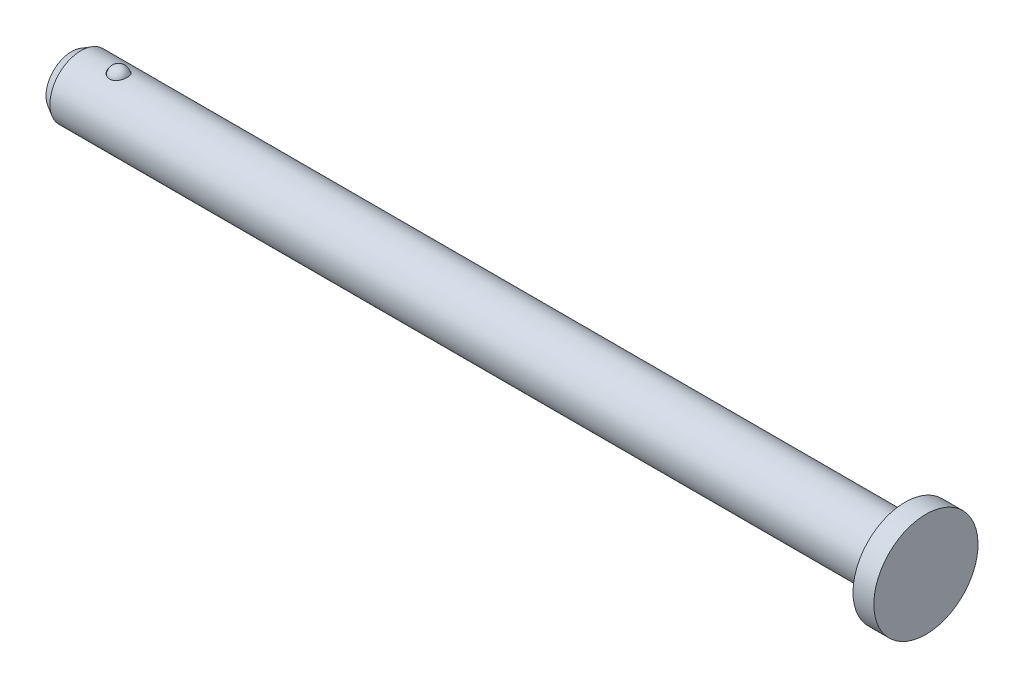
ISO-10303-21;
HEADER;
FILE_DESCRIPTION(('STEP AP214'),'2;1');
FILE_NAME('part.step','',(''),(''),'','','');
FILE_SCHEMA(('AUTOMOTIVE_DESIGN { 1 0 10303 214 1 1 1 1 }'));
ENDSEC;
DATA;
#1=APPLICATION_CONTEXT('core data for automotive mechanical design processes');
#2=APPLICATION_PROTOCOL_DEFINITION('international standard','automotive_design',2000,#1);
#3=PRODUCT_CONTEXT('',#1,'mechanical');
#4=PRODUCT('Part','Part','',(#3));
#5=PRODUCT_RELATED_PRODUCT_CATEGORY('part','',(#4));
#6=PRODUCT_DEFINITION_FORMATION('','',#4);
#7=PRODUCT_DEFINITION_CONTEXT('part definition',#1,'design');
#8=PRODUCT_DEFINITION('design','',#6,#7);
#9=PRODUCT_DEFINITION_SHAPE('','',#8);
#10=(LENGTH_UNIT() NAMED_UNIT(*) SI_UNIT(.MILLI.,.METRE.));
#11=(NAMED_UNIT(*) PLANE_ANGLE_UNIT() SI_UNIT($,.RADIAN.));
#12=(NAMED_UNIT(*) SI_UNIT($,.STERADIAN.) SOLID_ANGLE_UNIT());
#13=UNCERTAINTY_MEASURE_WITH_UNIT(LENGTH_MEASURE(1.E-05),#10,'distance_accuracy_value','');
#14=(GEOMETRIC_REPRESENTATION_CONTEXT(3) GLOBAL_UNCERTAINTY_ASSIGNED_CONTEXT((#13)) GLOBAL_UNIT_ASSIGNED_CONTEXT((#10,
#11,#12)) REPRESENTATION_CONTEXT('',''));
#15=CARTESIAN_POINT('',(0.,0.,0.));
#16=DIRECTION('',(0.,0.,1.));
#17=DIRECTION('',(1.,0.,0.));
#18=AXIS2_PLACEMENT_3D('',#15,#16,#17);
#19=CARTESIAN_POINT('',(-28.96235,2.15077515008186,0.));
#20=DIRECTION('',(-1.,0.,0.));
#21=DIRECTION('',(0.,1.,0.));
#22=AXIS2_PLACEMENT_3D('',#19,#20,#21);
#23=SPHERICAL_SURFACE('',#22,0.668624849918136);
#24=CARTESIAN_POINT('',(-29.6309748499181,2.15077515008186,0.));
#25=VERTEX_POINT('',#24);
#26=VERTEX_LOOP('',#25);
#27=FACE_BOUND('',#26,.T.);
#28=ADVANCED_FACE('F41',(#27),#23,.T.);
#29=CLOSED_SHELL('',(#28));
#30=MANIFOLD_SOLID_BREP('B2',#29);
#31=CARTESIAN_POINT('',(-32.54375,0.,0.));
#32=DIRECTION('',(-1.,0.,0.));
#33=DIRECTION('',(0.,-1.,0.));
#34=AXIS2_PLACEMENT_3D('',#31,#32,#33);
#35=CYLINDRICAL_SURFACE('',#34,2.3622);
#36=CARTESIAN_POINT('',(-31.83509,0.,0.));
#37=DIRECTION('',(-1.,0.,0.));
#38=DIRECTION('',(0.,-1.,0.));
#39=AXIS2_PLACEMENT_3D('',#36,#37,#38);
#40=CIRCLE('',#39,2.3622);
#41=CARTESIAN_POINT('',(-31.83509,-2.3622,0.));
#42=VERTEX_POINT('',#41);
#43=EDGE_CURVE('E65',#42,#42,#40,.T.);
#44=ORIENTED_EDGE('',*,*,#43,.F.);
#45=EDGE_LOOP('',(#44));
#46=FACE_BOUND('',#45,.T.);
#47=CARTESIAN_POINT('',(30.95625,0.,0.));
#48=DIRECTION('',(-1.,0.,0.));
#49=DIRECTION('',(0.,-1.,0.));
#50=AXIS2_PLACEMENT_3D('',#47,#48,#49);
#51=CIRCLE('',#50,2.3622);
#52=CARTESIAN_POINT('',(30.95625,-2.3622,0.));
#53=VERTEX_POINT('',#52);
#54=EDGE_CURVE('E40',#53,#53,#51,.T.);
#55=ORIENTED_EDGE('',*,*,#54,.T.);
#56=EDGE_LOOP('',(#55));
#57=FACE_BOUND('',#56,.T.);
#58=CARTESIAN_POINT('',(-28.96235,2.26061568861246,-0.68527771626252));
#59=CARTESIAN_POINT('',(-28.9981003577525,2.26061606587637,-0.685277273676875));
#60=CARTESIAN_POINT('',(-29.0338558761443,2.26151617027457,-0.682328191990954));
#61=CARTESIAN_POINT('',(-29.1043241307773,2.26501256594584,-0.670628924672887));
#62=CARTESIAN_POINT('',(-29.139036543425,2.26760937800564,-0.661876957893491));
#63=CARTESIAN_POINT('',(-29.2063879710016,2.27419703679914,-0.638872769781651));
#64=CARTESIAN_POINT('',(-29.2390297704585,2.27818596236794,-0.624628125707574));
#65=CARTESIAN_POINT('',(-29.3014473625179,2.2871203937915,-0.591074648513028));
#66=CARTESIAN_POINT('',(-29.3312229678521,2.29206596208691,-0.571765484799128));
#67=CARTESIAN_POINT('',(-29.387849683659,2.30251425411889,-0.528138231878343));
#68=CARTESIAN_POINT('',(-29.4146183921795,2.3080271290392,-0.50371574088255));
#69=CARTESIAN_POINT('',(-29.4638315684833,2.31893810273102,-0.450825040976658));
#70=CARTESIAN_POINT('',(-29.4862752797543,2.32433618127614,-0.42235612579165));
#71=CARTESIAN_POINT('',(-29.5271962306323,2.33468535839672,-0.360890365910458));
#72=CARTESIAN_POINT('',(-29.545474224088,2.33960922615684,-0.327756151878));
#73=CARTESIAN_POINT('',(-29.5764625809135,2.34823370579925,-0.258830589686417));
#74=CARTESIAN_POINT('',(-29.5891722210393,2.35193415876337,-0.223038897067115));
#75=CARTESIAN_POINT('',(-29.6089758780873,2.35779553495124,-0.148985478061625));
#76=CARTESIAN_POINT('',(-29.6159441820834,2.35992189528996,-0.110687327133391));
#77=CARTESIAN_POINT('',(-29.6236587130189,2.36228000431994,-0.0334118724984288));
#78=CARTESIAN_POINT('',(-29.6244047199241,2.3625116860112,0.00556545517664293));
#79=CARTESIAN_POINT('',(-29.619648973422,2.36105304164831,0.0832695091515644));
#80=CARTESIAN_POINT('',(-29.6141204161284,2.35935446983474,0.121994444219967));
#81=CARTESIAN_POINT('',(-29.5968864816596,2.35420122285799,0.197924439206046));
#82=CARTESIAN_POINT('',(-29.5851809372851,2.35074650015925,0.235129457953105));
#83=CARTESIAN_POINT('',(-29.5558442419893,2.34245159114516,0.306947137487934));
#84=CARTESIAN_POINT('',(-29.5382149488056,2.33761183925715,0.341560606851114));
#85=CARTESIAN_POINT('',(-29.4974119203478,2.32707462071828,0.407208777186108));
#86=CARTESIAN_POINT('',(-29.4742381621746,2.321377150525,0.438243463376426));
#87=CARTESIAN_POINT('',(-29.4230968996923,2.30981677785119,0.49556496983312));
#88=CARTESIAN_POINT('',(-29.3951712708836,2.30395566564967,0.521889460259759));
#89=CARTESIAN_POINT('',(-29.3350854482871,2.29270452014407,0.569289029851732));
#90=CARTESIAN_POINT('',(-29.3029259796227,2.2873144064352,0.590365006138895));
#91=CARTESIAN_POINT('',(-29.2362883093647,2.27781122279079,0.626016335674667));
#92=CARTESIAN_POINT('',(-29.2019104791145,2.27366427622772,0.640770027256692));
#93=CARTESIAN_POINT('',(-29.1309949484246,2.2669358935126,0.664184172295553));
#94=CARTESIAN_POINT('',(-29.0944579107441,2.26435397969175,0.672846485051613));
#95=CARTESIAN_POINT('',(-29.0219644689336,2.26114968816279,0.683535456362576));
#96=CARTESIAN_POINT('',(-28.9860513920774,2.26044732634392,0.685833119887195));
#97=CARTESIAN_POINT('',(-28.9143491438063,2.26085268475195,0.684495882593757));
#98=CARTESIAN_POINT('',(-28.8785599557569,2.26196015171595,0.680861811847796));
#99=CARTESIAN_POINT('',(-28.8088732140829,2.26581480846639,0.667918873104038));
#100=CARTESIAN_POINT('',(-28.7749520344427,2.26852835411657,0.658726360243318));
#101=CARTESIAN_POINT('',(-28.7091491871207,2.27526782769972,0.635055545738869));
#102=CARTESIAN_POINT('',(-28.6772676754108,2.27929385585414,0.620576840430212));
#103=CARTESIAN_POINT('',(-28.6156998488559,2.28832608287352,0.586404324520774));
#104=CARTESIAN_POINT('',(-28.5860734502646,2.29335103411035,0.566607698356494));
#105=CARTESIAN_POINT('',(-28.5304673722909,2.30379730450468,0.522512365352815));
#106=CARTESIAN_POINT('',(-28.5044884035125,2.30921870058682,0.498212783366469));
#107=CARTESIAN_POINT('',(-28.4557248823079,2.32014037933166,0.444650412524104));
#108=CARTESIAN_POINT('',(-28.4331213283413,2.32563434130997,0.415221488016185));
#109=CARTESIAN_POINT('',(-28.3929621012787,2.33589045156673,0.352985492875238));
#110=CARTESIAN_POINT('',(-28.3754072783992,2.34065247652274,0.320177854521938));
#111=CARTESIAN_POINT('',(-28.3452296963968,2.34909575789112,0.250977060471378));
#112=CARTESIAN_POINT('',(-28.3327806001295,2.35273804278871,0.214503292798677));
#113=CARTESIAN_POINT('',(-28.3138920837387,2.3583497472957,0.139907759737393));
#114=CARTESIAN_POINT('',(-28.307453075219,2.36031905232949,0.101785881664248));
#115=CARTESIAN_POINT('',(-28.3006810630048,2.36239150540717,0.0245489796177243));
#116=CARTESIAN_POINT('',(-28.3004127224282,2.36247489053689,-0.0145722644934081));
#117=CARTESIAN_POINT('',(-28.3061530694644,2.36071597425377,-0.0923081115385676));
#118=CARTESIAN_POINT('',(-28.3121619093268,2.35887362613332,-0.13092270216099));
#119=CARTESIAN_POINT('',(-28.3303402956568,2.35345527079736,-0.206585415296579));
#120=CARTESIAN_POINT('',(-28.3425155333345,2.3498776621713,-0.243632056400328));
#121=CARTESIAN_POINT('',(-28.3727734314074,2.34137091229151,-0.31506479596776));
#122=CARTESIAN_POINT('',(-28.3908562033358,2.33644174552089,-0.349450844184804));
#123=CARTESIAN_POINT('',(-28.4324721073872,2.32578758613149,-0.414468667700137));
#124=CARTESIAN_POINT('',(-28.4559889007523,2.32006499936024,-0.445111284559731));
#125=CARTESIAN_POINT('',(-28.5079624948679,2.30845768177124,-0.501848667394621));
#126=CARTESIAN_POINT('',(-28.5364192622946,2.30257295204749,-0.527943464045894));
#127=CARTESIAN_POINT('',(-28.5969679176658,2.29144329812784,-0.574313399568975));
#128=CARTESIAN_POINT('',(-28.6289801235149,2.28618831188781,-0.594690041428014));
#129=CARTESIAN_POINT('',(-28.6961907685536,2.27682278715415,-0.629599579080477));
#130=CARTESIAN_POINT('',(-28.7313871962058,2.27271153274013,-0.644136133027146));
#131=CARTESIAN_POINT('',(-28.7990209249959,2.26658806385052,-0.665335954151695));
#132=CARTESIAN_POINT('',(-28.8311918971557,2.26436779574732,-0.672795633013494));
#133=CARTESIAN_POINT('',(-28.8963571968589,2.261381543176,-0.682766346875875));
#134=CARTESIAN_POINT('',(-28.9293514000444,2.26061534038711,-0.685278124781695));
#135=CARTESIAN_POINT('',(-28.96235,2.26061568861246,-0.68527771626252));
#136=B_SPLINE_CURVE_WITH_KNOTS('',3,(#58,#59,#60,#61,#62,#63,#64,#65,#66,#67,#68,#69,#70,#71,
#72,#73,#74,#75,#76,#77,#78,#79,#80,#81,#82,#83,#84,#85,#86,#87,#88,#89,#90,#91,#92,#93,#94,#95,
#96,#97,#98,#99,#100,#101,#102,#103,#104,#105,#106,#107,#108,#109,#110,#111,#112,#113,#114,#115,
#116,#117,#118,#119,#120,#121,#122,#123,#124,#125,#126,#127,#128,#129,#130,#131,#132,#133,#134,
#135),.UNSPECIFIED.,.T.,.F.,(4,2,2,2,2,2,2,2,2,2,2,2,2,2,2,2,2,2,2,2,2,2,2,2,2,2,2,2,2,2,2,2,2,
2,2,2,2,2,4),(0.,0.107129347497799,0.21429159268839,0.321306531271752,0.42832845714054,
0.537796601472523,0.647283876217023,0.761239240287445,0.875209401031059,0.991613306444481,
1.10802132813858,1.22492850321203,1.34183884290273,1.45871255269125,1.57558674518755,
1.69147980573786,1.80735304321721,1.91969936067576,2.03201137125525,2.13946175970587,
2.24689711310623,2.35215781780268,2.45742656211278,2.56489871878997,2.67239178456855,
2.78441965492101,2.89646637995816,3.01205897550696,3.12765948688756,3.24447084310921,
3.36128503259211,3.47820723146746,3.59513163793885,3.71170895392308,3.82828548353903,
3.94263861178487,4.05691999865489,4.15581829244292,4.25470173596152),.UNSPECIFIED.);
#137=CARTESIAN_POINT('',(-28.96235,2.26061568861246,-0.68527771626252));
#138=VERTEX_POINT('',#137);
#139=EDGE_CURVE('E57',#138,#138,#136,.T.);
#140=ORIENTED_EDGE('',*,*,#139,.F.);
#141=EDGE_LOOP('',(#140));
#142=FACE_BOUND('',#141,.T.);
#143=ADVANCED_FACE('F53',(#46,#57,#142),#35,.T.);
#144=CARTESIAN_POINT('',(30.95625,2.3622,0.));
#145=DIRECTION('',(1.,0.,0.));
#146=DIRECTION('',(0.,1.,0.));
#147=AXIS2_PLACEMENT_3D('',#144,#145,#146);
#148=PLANE('',#147);
#149=ORIENTED_EDGE('',*,*,#54,.F.);
#150=EDGE_LOOP('',(#149));
#151=FACE_BOUND('',#150,.T.);
#152=CARTESIAN_POINT('',(30.95625,0.,0.));
#153=DIRECTION('',(-1.,0.,0.));
#154=DIRECTION('',(0.,-1.,0.));
#155=AXIS2_PLACEMENT_3D('',#152,#153,#154);
#156=CIRCLE('',#155,3.96875);
#157=CARTESIAN_POINT('',(30.95625,-3.96875,0.));
#158=VERTEX_POINT('',#157);
#159=EDGE_CURVE('E77',#158,#158,#156,.T.);
#160=ORIENTED_EDGE('',*,*,#159,.T.);
#161=EDGE_LOOP('',(#160));
#162=FACE_BOUND('',#161,.T.);
#163=ADVANCED_FACE('F55',(#151,#162),#148,.F.);
#164=CARTESIAN_POINT('',(-31.83509,0.,0.));
#165=DIRECTION('',(1.,0.,0.));
#166=DIRECTION('',(0.,1.,0.));
#167=AXIS2_PLACEMENT_3D('',#164,#165,#166);
#168=CONICAL_SURFACE('',#167,2.3622,0.523598775598295);
#169=CARTESIAN_POINT('',(-32.54375,0.,0.));
#170=DIRECTION('',(-1.,0.,0.));
#171=DIRECTION('',(0.,-1.,0.));
#172=AXIS2_PLACEMENT_3D('',#169,#170,#171);
#173=CIRCLE('',#172,1.95305495823608);
#174=CARTESIAN_POINT('',(-32.54375,-1.95305495823608,0.));
#175=VERTEX_POINT('',#174);
#176=EDGE_CURVE('E69',#175,#175,#173,.T.);
#177=ORIENTED_EDGE('',*,*,#176,.F.);
#178=EDGE_LOOP('',(#177));
#179=FACE_BOUND('',#178,.T.);
#180=ORIENTED_EDGE('',*,*,#43,.T.);
#181=EDGE_LOOP('',(#180));
#182=FACE_BOUND('',#181,.T.);
#183=ADVANCED_FACE('F91',(#179,#182),#168,.T.);
#184=CARTESIAN_POINT('',(-32.54375,1.95305495823608,0.));
#185=DIRECTION('',(1.,0.,0.));
#186=DIRECTION('',(0.,1.,0.));
#187=AXIS2_PLACEMENT_3D('',#184,#185,#186);
#188=PLANE('',#187);
#189=ORIENTED_EDGE('',*,*,#176,.T.);
#190=EDGE_LOOP('',(#189));
#191=FACE_BOUND('',#190,.T.);
#192=ADVANCED_FACE('F98',(#191),#188,.F.);
#193=CARTESIAN_POINT('',(32.54375,3.96875,0.));
#194=DIRECTION('',(-1.,0.,0.));
#195=DIRECTION('',(0.,-1.,0.));
#196=AXIS2_PLACEMENT_3D('',#193,#194,#195);
#197=PLANE('',#196);
#198=CARTESIAN_POINT('',(32.54375,0.,0.));
#199=DIRECTION('',(-1.,0.,0.));
#200=DIRECTION('',(0.,-1.,0.));
#201=AXIS2_PLACEMENT_3D('',#198,#199,#200);
#202=CIRCLE('',#201,3.96875);
#203=CARTESIAN_POINT('',(32.54375,-3.96875,0.));
#204=VERTEX_POINT('',#203);
#205=EDGE_CURVE('E74',#204,#204,#202,.T.);
#206=ORIENTED_EDGE('',*,*,#205,.F.);
#207=EDGE_LOOP('',(#206));
#208=FACE_BOUND('',#207,.T.);
#209=ADVANCED_FACE('F102',(#208),#197,.F.);
#210=CARTESIAN_POINT('',(-32.54375,0.,0.));
#211=DIRECTION('',(-1.,0.,0.));
#212=DIRECTION('',(0.,-1.,0.));
#213=AXIS2_PLACEMENT_3D('',#210,#211,#212);
#214=CYLINDRICAL_SURFACE('',#213,3.96875);
#215=ORIENTED_EDGE('',*,*,#159,.F.);
#216=EDGE_LOOP('',(#215));
#217=FACE_BOUND('',#216,.T.);
#218=ORIENTED_EDGE('',*,*,#205,.T.);
#219=EDGE_LOOP('',(#218));
#220=FACE_BOUND('',#219,.T.);
#221=ADVANCED_FACE('F106',(#217,#220),#214,.T.);
#222=CARTESIAN_POINT('',(-28.96235,2.15077515008186,0.));
#223=DIRECTION('',(-1.,0.,0.));
#224=DIRECTION('',(0.,1.,0.));
#225=AXIS2_PLACEMENT_3D('',#222,#223,#224);
#226=SPHERICAL_SURFACE('',#225,0.694024849918134);
#227=ORIENTED_EDGE('',*,*,#139,.T.);
#228=EDGE_LOOP('',(#227));
#229=FACE_BOUND('',#228,.T.);
#230=ADVANCED_FACE('F84',(#229),#226,.F.);
#231=CLOSED_SHELL('',(#143,#163,#183,#192,#209,#221,#230));
#232=MANIFOLD_SOLID_BREP('B6',#231);
#233=ADVANCED_BREP_SHAPE_REPRESENTATION('',(#18,#30,#232),#14);
#234=SHAPE_DEFINITION_REPRESENTATION(#9,#233);
ENDSEC;
END-ISO-10303-21;
